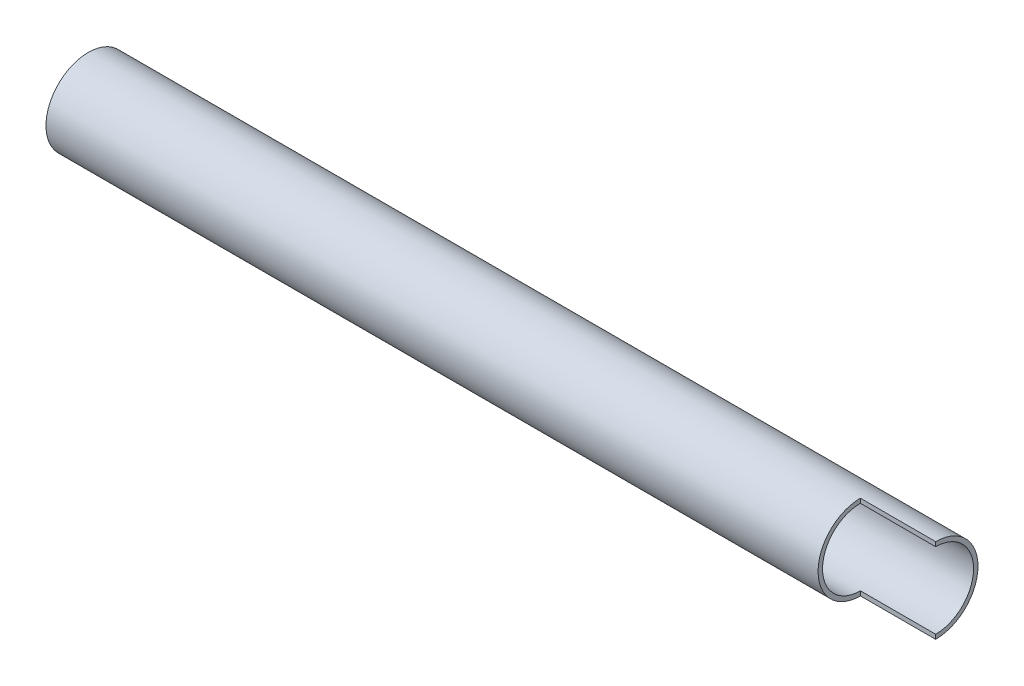
ISO-10303-21;
HEADER;
FILE_DESCRIPTION(('STEP AP214'),'2;1');
FILE_NAME('part.step','',(''),(''),'','','');
FILE_SCHEMA(('AUTOMOTIVE_DESIGN { 1 0 10303 214 1 1 1 1 }'));
ENDSEC;
DATA;
#1=APPLICATION_CONTEXT('core data for automotive mechanical design processes');
#2=APPLICATION_PROTOCOL_DEFINITION('international standard','automotive_design',2000,#1);
#3=PRODUCT_CONTEXT('',#1,'mechanical');
#4=PRODUCT('Part','Part','',(#3));
#5=PRODUCT_RELATED_PRODUCT_CATEGORY('part','',(#4));
#6=PRODUCT_DEFINITION_FORMATION('','',#4);
#7=PRODUCT_DEFINITION_CONTEXT('part definition',#1,'design');
#8=PRODUCT_DEFINITION('design','',#6,#7);
#9=PRODUCT_DEFINITION_SHAPE('','',#8);
#10=(LENGTH_UNIT() NAMED_UNIT(*) SI_UNIT(.MILLI.,.METRE.));
#11=(NAMED_UNIT(*) PLANE_ANGLE_UNIT() SI_UNIT($,.RADIAN.));
#12=(NAMED_UNIT(*) SI_UNIT($,.STERADIAN.) SOLID_ANGLE_UNIT());
#13=UNCERTAINTY_MEASURE_WITH_UNIT(LENGTH_MEASURE(1.E-05),#10,'distance_accuracy_value','');
#14=(GEOMETRIC_REPRESENTATION_CONTEXT(3) GLOBAL_UNCERTAINTY_ASSIGNED_CONTEXT((#13)) GLOBAL_UNIT_ASSIGNED_CONTEXT((#10,
#11,#12)) REPRESENTATION_CONTEXT('',''));
#15=CARTESIAN_POINT('',(0.,0.,0.));
#16=DIRECTION('',(0.,0.,1.));
#17=DIRECTION('',(1.,0.,0.));
#18=AXIS2_PLACEMENT_3D('',#15,#16,#17);
#19=CARTESIAN_POINT('',(1144.,0.,0.));
#20=DIRECTION('',(1.,0.,0.));
#21=DIRECTION('',(0.,0.,-1.));
#22=AXIS2_PLACEMENT_3D('',#19,#20,#21);
#23=PLANE('',#22);
#24=CARTESIAN_POINT('',(1144.,0.,0.));
#25=DIRECTION('',(1.,0.,0.));
#26=DIRECTION('',(0.,0.,-1.));
#27=AXIS2_PLACEMENT_3D('',#24,#25,#26);
#28=CIRCLE('',#27,57.15);
#29=CARTESIAN_POINT('',(1144.,-57.15,0.));
#30=VERTEX_POINT('',#29);
#31=CARTESIAN_POINT('',(1144.,57.15,0.));
#32=VERTEX_POINT('',#31);
#33=EDGE_CURVE('E13',#30,#32,#28,.T.);
#34=ORIENTED_EDGE('',*,*,#33,.T.);
#35=DIRECTION('',(0.,-1.,0.));
#36=VECTOR('',#35,1.);
#37=CARTESIAN_POINT('',(1144.,0.,0.));
#38=LINE('',#37,#36);
#39=CARTESIAN_POINT('',(1144.,51.15,0.));
#40=VERTEX_POINT('',#39);
#41=EDGE_CURVE('E88',#32,#40,#38,.T.);
#42=ORIENTED_EDGE('',*,*,#41,.T.);
#43=CARTESIAN_POINT('',(1144.,0.,0.));
#44=DIRECTION('',(1.,0.,0.));
#45=DIRECTION('',(0.,0.,-1.));
#46=AXIS2_PLACEMENT_3D('',#43,#44,#45);
#47=CIRCLE('',#46,51.15);
#48=CARTESIAN_POINT('',(1144.,-51.15,0.));
#49=VERTEX_POINT('',#48);
#50=EDGE_CURVE('E111',#49,#40,#47,.T.);
#51=ORIENTED_EDGE('',*,*,#50,.F.);
#52=EDGE_CURVE('E99',#49,#30,#38,.T.);
#53=ORIENTED_EDGE('',*,*,#52,.T.);
#54=EDGE_LOOP('',(#34,#42,#51,#53));
#55=FACE_BOUND('',#54,.T.);
#56=ADVANCED_FACE('F44',(#55),#23,.T.);
#57=CARTESIAN_POINT('',(1144.,0.,0.));
#58=DIRECTION('',(-1.,0.,0.));
#59=DIRECTION('',(0.,0.,1.));
#60=AXIS2_PLACEMENT_3D('',#57,#58,#59);
#61=CYLINDRICAL_SURFACE('',#60,57.15);
#62=CARTESIAN_POINT('',(0.,0.,0.));
#63=DIRECTION('',(1.,0.,0.));
#64=DIRECTION('',(0.,0.,-1.));
#65=AXIS2_PLACEMENT_3D('',#62,#63,#64);
#66=CIRCLE('',#65,57.15);
#67=CARTESIAN_POINT('',(0.,0.,-57.15));
#68=VERTEX_POINT('',#67);
#69=EDGE_CURVE('E48',#68,#68,#66,.T.);
#70=ORIENTED_EDGE('',*,*,#69,.T.);
#71=EDGE_LOOP('',(#70));
#72=FACE_BOUND('',#71,.T.);
#73=DIRECTION('',(1.,0.,0.));
#74=VECTOR('',#73,1.);
#75=CARTESIAN_POINT('',(1042.4,57.15,0.));
#76=LINE('',#75,#74);
#77=CARTESIAN_POINT('',(1042.4,57.15,0.));
#78=VERTEX_POINT('',#77);
#79=EDGE_CURVE('E86',#78,#32,#76,.T.);
#80=ORIENTED_EDGE('',*,*,#79,.T.);
#81=ORIENTED_EDGE('',*,*,#33,.F.);
#82=DIRECTION('',(1.,0.,0.));
#83=VECTOR('',#82,1.);
#84=CARTESIAN_POINT('',(1042.4,-57.15,0.));
#85=LINE('',#84,#83);
#86=CARTESIAN_POINT('',(1042.4,-57.15,0.));
#87=VERTEX_POINT('',#86);
#88=EDGE_CURVE('E92',#87,#30,#85,.T.);
#89=ORIENTED_EDGE('',*,*,#88,.F.);
#90=CARTESIAN_POINT('',(1042.4,0.,0.));
#91=DIRECTION('',(1.,0.,0.));
#92=DIRECTION('',(0.,0.,-1.));
#93=AXIS2_PLACEMENT_3D('',#90,#91,#92);
#94=CIRCLE('',#93,57.15);
#95=EDGE_CURVE('E96',#78,#87,#94,.T.);
#96=ORIENTED_EDGE('',*,*,#95,.F.);
#97=EDGE_LOOP('',(#80,#81,#89,#96));
#98=FACE_BOUND('',#97,.T.);
#99=ADVANCED_FACE('F46',(#72,#98),#61,.T.);
#100=CARTESIAN_POINT('',(1144.,0.,0.));
#101=DIRECTION('',(-1.,0.,0.));
#102=DIRECTION('',(0.,0.,1.));
#103=AXIS2_PLACEMENT_3D('',#100,#101,#102);
#104=CYLINDRICAL_SURFACE('',#103,51.15);
#105=CARTESIAN_POINT('',(0.,0.,0.));
#106=DIRECTION('',(1.,0.,0.));
#107=DIRECTION('',(0.,0.,-1.));
#108=AXIS2_PLACEMENT_3D('',#105,#106,#107);
#109=CIRCLE('',#108,51.15);
#110=CARTESIAN_POINT('',(0.,0.,-51.15));
#111=VERTEX_POINT('',#110);
#112=EDGE_CURVE('E106',#111,#111,#109,.T.);
#113=ORIENTED_EDGE('',*,*,#112,.F.);
#114=EDGE_LOOP('',(#113));
#115=FACE_BOUND('',#114,.T.);
#116=ORIENTED_EDGE('',*,*,#50,.T.);
#117=DIRECTION('',(1.,0.,0.));
#118=VECTOR('',#117,1.);
#119=CARTESIAN_POINT('',(1042.4,51.15,0.));
#120=LINE('',#119,#118);
#121=CARTESIAN_POINT('',(1042.4,51.15,0.));
#122=VERTEX_POINT('',#121);
#123=EDGE_CURVE('E83',#122,#40,#120,.T.);
#124=ORIENTED_EDGE('',*,*,#123,.F.);
#125=CARTESIAN_POINT('',(1042.4,0.,0.));
#126=DIRECTION('',(1.,0.,0.));
#127=DIRECTION('',(0.,0.,-1.));
#128=AXIS2_PLACEMENT_3D('',#125,#126,#127);
#129=CIRCLE('',#128,51.15);
#130=CARTESIAN_POINT('',(1042.4,-51.15,0.));
#131=VERTEX_POINT('',#130);
#132=EDGE_CURVE('E93',#131,#122,#129,.F.);
#133=ORIENTED_EDGE('',*,*,#132,.F.);
#134=DIRECTION('',(1.,0.,0.));
#135=VECTOR('',#134,1.);
#136=CARTESIAN_POINT('',(1042.4,-51.15,0.));
#137=LINE('',#136,#135);
#138=EDGE_CURVE('E107',#131,#49,#137,.T.);
#139=ORIENTED_EDGE('',*,*,#138,.T.);
#140=EDGE_LOOP('',(#116,#124,#133,#139));
#141=FACE_BOUND('',#140,.T.);
#142=ADVANCED_FACE('F119',(#115,#141),#104,.F.);
#143=CARTESIAN_POINT('',(0.,0.,0.));
#144=DIRECTION('',(1.,0.,0.));
#145=DIRECTION('',(0.,0.,-1.));
#146=AXIS2_PLACEMENT_3D('',#143,#144,#145);
#147=PLANE('',#146);
#148=ORIENTED_EDGE('',*,*,#69,.F.);
#149=EDGE_LOOP('',(#148));
#150=FACE_BOUND('',#149,.T.);
#151=ORIENTED_EDGE('',*,*,#112,.T.);
#152=EDGE_LOOP('',(#151));
#153=FACE_BOUND('',#152,.T.);
#154=ADVANCED_FACE('F117',(#150,#153),#147,.F.);
#155=CARTESIAN_POINT('',(1042.4,0.,0.));
#156=DIRECTION('',(0.,0.,1.));
#157=DIRECTION('',(1.,0.,0.));
#158=AXIS2_PLACEMENT_3D('',#155,#156,#157);
#159=PLANE('',#158);
#160=ORIENTED_EDGE('',*,*,#41,.F.);
#161=ORIENTED_EDGE('',*,*,#79,.F.);
#162=DIRECTION('',(0.,-1.,0.));
#163=VECTOR('',#162,1.);
#164=CARTESIAN_POINT('',(1042.4,0.,0.));
#165=LINE('',#164,#163);
#166=EDGE_CURVE('E68',#78,#122,#165,.T.);
#167=ORIENTED_EDGE('',*,*,#166,.T.);
#168=ORIENTED_EDGE('',*,*,#123,.T.);
#169=EDGE_LOOP('',(#160,#161,#167,#168));
#170=FACE_BOUND('',#169,.T.);
#171=ADVANCED_FACE('F87',(#170),#159,.T.);
#172=ORIENTED_EDGE('',*,*,#52,.F.);
#173=ORIENTED_EDGE('',*,*,#138,.F.);
#174=EDGE_CURVE('E59',#131,#87,#165,.T.);
#175=ORIENTED_EDGE('',*,*,#174,.T.);
#176=ORIENTED_EDGE('',*,*,#88,.T.);
#177=EDGE_LOOP('',(#172,#173,#175,#176));
#178=FACE_BOUND('',#177,.T.);
#179=ADVANCED_FACE('F127',(#178),#159,.T.);
#180=CARTESIAN_POINT('',(1042.4,0.,0.));
#181=DIRECTION('',(1.,0.,0.));
#182=DIRECTION('',(0.,0.,-1.));
#183=AXIS2_PLACEMENT_3D('',#180,#181,#182);
#184=PLANE('',#183);
#185=ORIENTED_EDGE('',*,*,#166,.F.);
#186=ORIENTED_EDGE('',*,*,#95,.T.);
#187=ORIENTED_EDGE('',*,*,#174,.F.);
#188=ORIENTED_EDGE('',*,*,#132,.T.);
#189=EDGE_LOOP('',(#185,#186,#187,#188));
#190=FACE_BOUND('',#189,.T.);
#191=ADVANCED_FACE('F95',(#190),#184,.T.);
#192=CLOSED_SHELL('',(#56,#99,#142,#154,#171,#179,#191));
#193=MANIFOLD_SOLID_BREP('B2',#192);
#194=ADVANCED_BREP_SHAPE_REPRESENTATION('',(#18,#193),#14);
#195=SHAPE_DEFINITION_REPRESENTATION(#9,#194);
ENDSEC;
END-ISO-10303-21;
